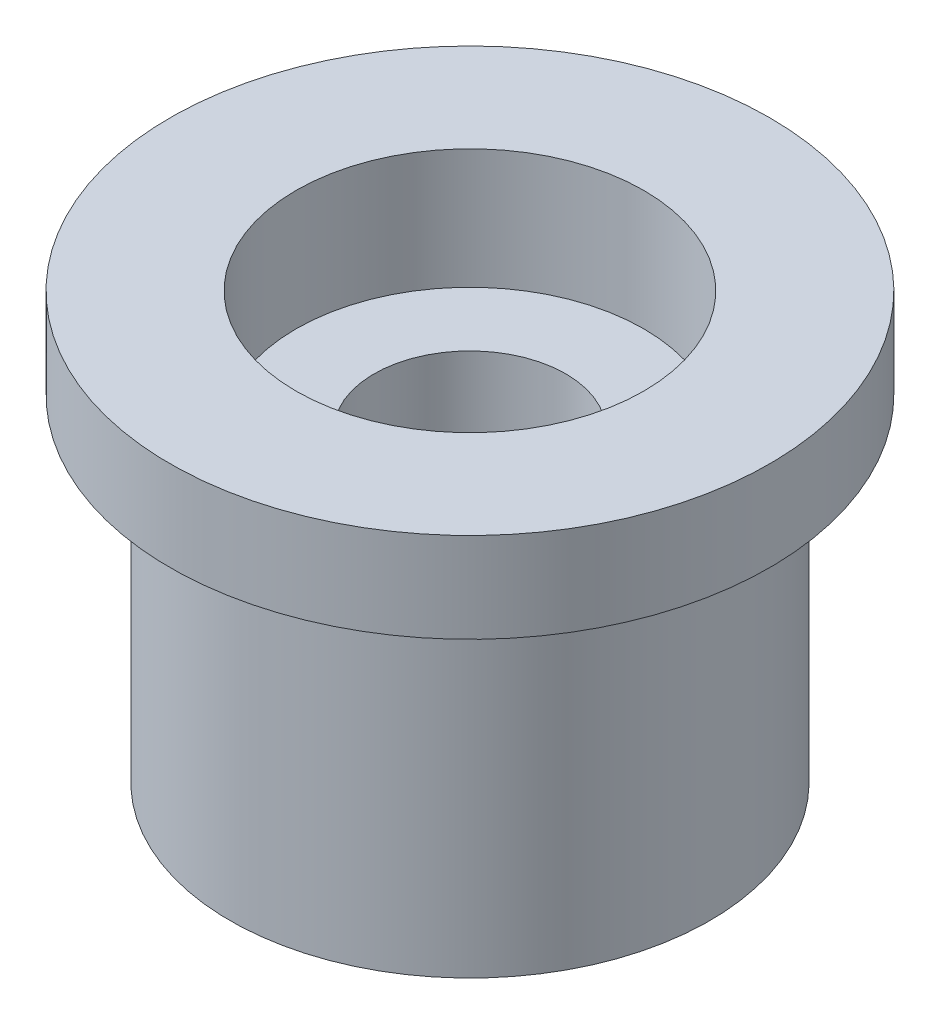
ISO-10303-21;
HEADER;
FILE_DESCRIPTION(('STEP AP214'),'2;1');
FILE_NAME('part.step','',(''),(''),'','','');
FILE_SCHEMA(('AUTOMOTIVE_DESIGN { 1 0 10303 214 1 1 1 1 }'));
ENDSEC;
DATA;
#1=APPLICATION_CONTEXT('core data for automotive mechanical design processes');
#2=APPLICATION_PROTOCOL_DEFINITION('international standard','automotive_design',2000,#1);
#3=PRODUCT_CONTEXT('',#1,'mechanical');
#4=PRODUCT('Part','Part','',(#3));
#5=PRODUCT_RELATED_PRODUCT_CATEGORY('part','',(#4));
#6=PRODUCT_DEFINITION_FORMATION('','',#4);
#7=PRODUCT_DEFINITION_CONTEXT('part definition',#1,'design');
#8=PRODUCT_DEFINITION('design','',#6,#7);
#9=PRODUCT_DEFINITION_SHAPE('','',#8);
#10=(LENGTH_UNIT() NAMED_UNIT(*) SI_UNIT(.MILLI.,.METRE.));
#11=(NAMED_UNIT(*) PLANE_ANGLE_UNIT() SI_UNIT($,.RADIAN.));
#12=(NAMED_UNIT(*) SI_UNIT($,.STERADIAN.) SOLID_ANGLE_UNIT());
#13=UNCERTAINTY_MEASURE_WITH_UNIT(LENGTH_MEASURE(1.E-05),#10,'distance_accuracy_value','');
#14=(GEOMETRIC_REPRESENTATION_CONTEXT(3) GLOBAL_UNCERTAINTY_ASSIGNED_CONTEXT((#13)) GLOBAL_UNIT_ASSIGNED_CONTEXT((#10,
#11,#12)) REPRESENTATION_CONTEXT('',''));
#15=CARTESIAN_POINT('',(0.,0.,0.));
#16=DIRECTION('',(0.,0.,1.));
#17=DIRECTION('',(1.,0.,0.));
#18=AXIS2_PLACEMENT_3D('',#15,#16,#17);
#19=CARTESIAN_POINT('',(0.,0.,0.));
#20=DIRECTION('',(0.,-1.,0.));
#21=DIRECTION('',(0.,0.,-1.));
#22=AXIS2_PLACEMENT_3D('',#19,#20,#21);
#23=CYLINDRICAL_SURFACE('',#22,1.6);
#24=CARTESIAN_POINT('',(0.,5.1,0.));
#25=DIRECTION('',(0.,-1.,0.));
#26=DIRECTION('',(0.,0.,-1.));
#27=AXIS2_PLACEMENT_3D('',#24,#25,#26);
#28=CIRCLE('',#27,1.6);
#29=CARTESIAN_POINT('',(0.,5.1,-1.6));
#30=VERTEX_POINT('',#29);
#31=EDGE_CURVE('E65',#30,#30,#28,.T.);
#32=ORIENTED_EDGE('',*,*,#31,.F.);
#33=EDGE_LOOP('',(#32));
#34=FACE_BOUND('',#33,.T.);
#35=CARTESIAN_POINT('',(0.,0.,0.));
#36=DIRECTION('',(0.,-1.,0.));
#37=DIRECTION('',(0.,0.,-1.));
#38=AXIS2_PLACEMENT_3D('',#35,#36,#37);
#39=CIRCLE('',#38,1.6);
#40=CARTESIAN_POINT('',(0.,0.,-1.6));
#41=VERTEX_POINT('',#40);
#42=EDGE_CURVE('E10',#41,#41,#39,.T.);
#43=ORIENTED_EDGE('',*,*,#42,.T.);
#44=EDGE_LOOP('',(#43));
#45=FACE_BOUND('',#44,.T.);
#46=ADVANCED_FACE('F37',(#34,#45),#23,.F.);
#47=CARTESIAN_POINT('',(-1.6,0.,0.));
#48=DIRECTION('',(0.,1.,0.));
#49=DIRECTION('',(0.,0.,1.));
#50=AXIS2_PLACEMENT_3D('',#47,#48,#49);
#51=PLANE('',#50);
#52=ORIENTED_EDGE('',*,*,#42,.F.);
#53=EDGE_LOOP('',(#52));
#54=FACE_BOUND('',#53,.T.);
#55=CARTESIAN_POINT('',(0.,0.,0.));
#56=DIRECTION('',(0.,-1.,0.));
#57=DIRECTION('',(0.,0.,-1.));
#58=AXIS2_PLACEMENT_3D('',#55,#56,#57);
#59=CIRCLE('',#58,4.);
#60=CARTESIAN_POINT('',(0.,0.,-4.));
#61=VERTEX_POINT('',#60);
#62=EDGE_CURVE('E43',#61,#61,#59,.T.);
#63=ORIENTED_EDGE('',*,*,#62,.T.);
#64=EDGE_LOOP('',(#63));
#65=FACE_BOUND('',#64,.T.);
#66=ADVANCED_FACE('F72',(#54,#65),#51,.F.);
#67=CARTESIAN_POINT('',(0.,0.,0.));
#68=DIRECTION('',(0.,-1.,0.));
#69=DIRECTION('',(0.,0.,-1.));
#70=AXIS2_PLACEMENT_3D('',#67,#68,#69);
#71=CYLINDRICAL_SURFACE('',#70,4.);
#72=ORIENTED_EDGE('',*,*,#62,.F.);
#73=EDGE_LOOP('',(#72));
#74=FACE_BOUND('',#73,.T.);
#75=CARTESIAN_POINT('',(0.,5.6,0.));
#76=DIRECTION('',(0.,-1.,0.));
#77=DIRECTION('',(0.,0.,-1.));
#78=AXIS2_PLACEMENT_3D('',#75,#76,#77);
#79=CIRCLE('',#78,4.);
#80=CARTESIAN_POINT('',(0.,5.6,-4.));
#81=VERTEX_POINT('',#80);
#82=EDGE_CURVE('E47',#81,#81,#79,.T.);
#83=ORIENTED_EDGE('',*,*,#82,.T.);
#84=EDGE_LOOP('',(#83));
#85=FACE_BOUND('',#84,.T.);
#86=ADVANCED_FACE('F76',(#74,#85),#71,.T.);
#87=CARTESIAN_POINT('',(-4.,5.6,0.));
#88=DIRECTION('',(0.,1.,0.));
#89=DIRECTION('',(0.,0.,1.));
#90=AXIS2_PLACEMENT_3D('',#87,#88,#89);
#91=PLANE('',#90);
#92=ORIENTED_EDGE('',*,*,#82,.F.);
#93=EDGE_LOOP('',(#92));
#94=FACE_BOUND('',#93,.T.);
#95=CARTESIAN_POINT('',(0.,5.6,0.));
#96=DIRECTION('',(0.,-1.,0.));
#97=DIRECTION('',(0.,0.,-1.));
#98=AXIS2_PLACEMENT_3D('',#95,#96,#97);
#99=CIRCLE('',#98,5.);
#100=CARTESIAN_POINT('',(0.,5.6,-5.));
#101=VERTEX_POINT('',#100);
#102=EDGE_CURVE('E51',#101,#101,#99,.T.);
#103=ORIENTED_EDGE('',*,*,#102,.T.);
#104=EDGE_LOOP('',(#103));
#105=FACE_BOUND('',#104,.T.);
#106=ADVANCED_FACE('F81',(#94,#105),#91,.F.);
#107=CARTESIAN_POINT('',(0.,0.,0.));
#108=DIRECTION('',(0.,-1.,0.));
#109=DIRECTION('',(0.,0.,-1.));
#110=AXIS2_PLACEMENT_3D('',#107,#108,#109);
#111=CYLINDRICAL_SURFACE('',#110,5.);
#112=ORIENTED_EDGE('',*,*,#102,.F.);
#113=EDGE_LOOP('',(#112));
#114=FACE_BOUND('',#113,.T.);
#115=CARTESIAN_POINT('',(0.,7.1,0.));
#116=DIRECTION('',(0.,-1.,0.));
#117=DIRECTION('',(0.,0.,-1.));
#118=AXIS2_PLACEMENT_3D('',#115,#116,#117);
#119=CIRCLE('',#118,5.);
#120=CARTESIAN_POINT('',(0.,7.1,-5.));
#121=VERTEX_POINT('',#120);
#122=EDGE_CURVE('E56',#121,#121,#119,.T.);
#123=ORIENTED_EDGE('',*,*,#122,.T.);
#124=EDGE_LOOP('',(#123));
#125=FACE_BOUND('',#124,.T.);
#126=ADVANCED_FACE('F87',(#114,#125),#111,.T.);
#127=CARTESIAN_POINT('',(-5.,7.1,0.));
#128=DIRECTION('',(0.,-1.,0.));
#129=DIRECTION('',(0.,0.,-1.));
#130=AXIS2_PLACEMENT_3D('',#127,#128,#129);
#131=PLANE('',#130);
#132=ORIENTED_EDGE('',*,*,#122,.F.);
#133=EDGE_LOOP('',(#132));
#134=FACE_BOUND('',#133,.T.);
#135=CARTESIAN_POINT('',(0.,7.1,0.));
#136=DIRECTION('',(0.,-1.,0.));
#137=DIRECTION('',(0.,0.,-1.));
#138=AXIS2_PLACEMENT_3D('',#135,#136,#137);
#139=CIRCLE('',#138,2.9);
#140=CARTESIAN_POINT('',(0.,7.1,-2.9));
#141=VERTEX_POINT('',#140);
#142=EDGE_CURVE('E59',#141,#141,#139,.T.);
#143=ORIENTED_EDGE('',*,*,#142,.T.);
#144=EDGE_LOOP('',(#143));
#145=FACE_BOUND('',#144,.T.);
#146=ADVANCED_FACE('F91',(#134,#145),#131,.F.);
#147=CARTESIAN_POINT('',(0.,0.,0.));
#148=DIRECTION('',(0.,-1.,0.));
#149=DIRECTION('',(0.,0.,-1.));
#150=AXIS2_PLACEMENT_3D('',#147,#148,#149);
#151=CYLINDRICAL_SURFACE('',#150,2.9);
#152=ORIENTED_EDGE('',*,*,#142,.F.);
#153=EDGE_LOOP('',(#152));
#154=FACE_BOUND('',#153,.T.);
#155=CARTESIAN_POINT('',(0.,5.1,0.));
#156=DIRECTION('',(0.,-1.,0.));
#157=DIRECTION('',(0.,0.,-1.));
#158=AXIS2_PLACEMENT_3D('',#155,#156,#157);
#159=CIRCLE('',#158,2.9);
#160=CARTESIAN_POINT('',(0.,5.1,-2.9));
#161=VERTEX_POINT('',#160);
#162=EDGE_CURVE('E62',#161,#161,#159,.T.);
#163=ORIENTED_EDGE('',*,*,#162,.T.);
#164=EDGE_LOOP('',(#163));
#165=FACE_BOUND('',#164,.T.);
#166=ADVANCED_FACE('F95',(#154,#165),#151,.F.);
#167=CARTESIAN_POINT('',(-2.9,5.1,0.));
#168=DIRECTION('',(0.,-1.,0.));
#169=DIRECTION('',(0.,0.,-1.));
#170=AXIS2_PLACEMENT_3D('',#167,#168,#169);
#171=PLANE('',#170);
#172=ORIENTED_EDGE('',*,*,#162,.F.);
#173=EDGE_LOOP('',(#172));
#174=FACE_BOUND('',#173,.T.);
#175=ORIENTED_EDGE('',*,*,#31,.T.);
#176=EDGE_LOOP('',(#175));
#177=FACE_BOUND('',#176,.T.);
#178=ADVANCED_FACE('F69',(#174,#177),#171,.F.);
#179=CLOSED_SHELL('',(#46,#66,#86,#106,#126,#146,#166,#178));
#180=MANIFOLD_SOLID_BREP('B2',#179);
#181=ADVANCED_BREP_SHAPE_REPRESENTATION('',(#18,#180),#14);
#182=SHAPE_DEFINITION_REPRESENTATION(#9,#181);
ENDSEC;
END-ISO-10303-21;
